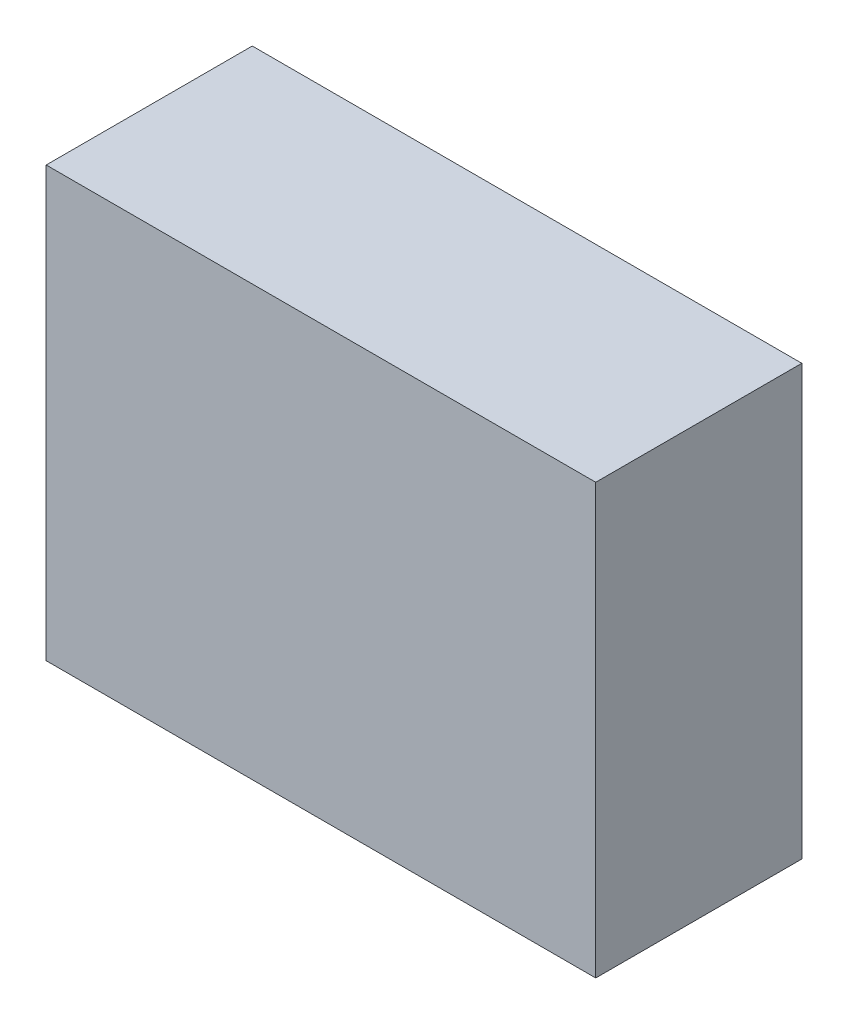
ISO-10303-21;
HEADER;
FILE_DESCRIPTION(('STEP AP214'),'2;1');
FILE_NAME('part.step','',(''),(''),'','','');
FILE_SCHEMA(('AUTOMOTIVE_DESIGN { 1 0 10303 214 1 1 1 1 }'));
ENDSEC;
DATA;
#1=APPLICATION_CONTEXT('core data for automotive mechanical design processes');
#2=APPLICATION_PROTOCOL_DEFINITION('international standard','automotive_design',2000,#1);
#3=PRODUCT_CONTEXT('',#1,'mechanical');
#4=PRODUCT('Part','Part','',(#3));
#5=PRODUCT_RELATED_PRODUCT_CATEGORY('part','',(#4));
#6=PRODUCT_DEFINITION_FORMATION('','',#4);
#7=PRODUCT_DEFINITION_CONTEXT('part definition',#1,'design');
#8=PRODUCT_DEFINITION('design','',#6,#7);
#9=PRODUCT_DEFINITION_SHAPE('','',#8);
#10=(LENGTH_UNIT() NAMED_UNIT(*) SI_UNIT(.MILLI.,.METRE.));
#11=(NAMED_UNIT(*) PLANE_ANGLE_UNIT() SI_UNIT($,.RADIAN.));
#12=(NAMED_UNIT(*) SI_UNIT($,.STERADIAN.) SOLID_ANGLE_UNIT());
#13=UNCERTAINTY_MEASURE_WITH_UNIT(LENGTH_MEASURE(1.E-05),#10,'distance_accuracy_value','');
#14=(GEOMETRIC_REPRESENTATION_CONTEXT(3) GLOBAL_UNCERTAINTY_ASSIGNED_CONTEXT((#13)) GLOBAL_UNIT_ASSIGNED_CONTEXT((#10,
#11,#12)) REPRESENTATION_CONTEXT('',''));
#15=CARTESIAN_POINT('',(0.,0.,0.));
#16=DIRECTION('',(0.,0.,1.));
#17=DIRECTION('',(1.,0.,0.));
#18=AXIS2_PLACEMENT_3D('',#15,#16,#17);
#19=CARTESIAN_POINT('',(24.,-18.75,18.));
#20=DIRECTION('',(-1.,0.,0.));
#21=DIRECTION('',(0.,0.,1.));
#22=AXIS2_PLACEMENT_3D('',#19,#20,#21);
#23=PLANE('',#22);
#24=DIRECTION('',(0.,1.,0.));
#25=VECTOR('',#24,1.);
#26=CARTESIAN_POINT('',(24.,-18.75,0.));
#27=LINE('',#26,#25);
#28=CARTESIAN_POINT('',(24.,-18.75,0.));
#29=VERTEX_POINT('',#28);
#30=CARTESIAN_POINT('',(24.,18.75,0.));
#31=VERTEX_POINT('',#30);
#32=EDGE_CURVE('E111',#29,#31,#27,.T.);
#33=ORIENTED_EDGE('',*,*,#32,.T.);
#34=DIRECTION('',(0.,0.,-1.));
#35=VECTOR('',#34,1.);
#36=CARTESIAN_POINT('',(24.,18.75,18.));
#37=LINE('',#36,#35);
#38=CARTESIAN_POINT('',(24.,18.75,18.));
#39=VERTEX_POINT('',#38);
#40=EDGE_CURVE('E11',#39,#31,#37,.T.);
#41=ORIENTED_EDGE('',*,*,#40,.F.);
#42=DIRECTION('',(0.,1.,0.));
#43=VECTOR('',#42,1.);
#44=CARTESIAN_POINT('',(24.,-18.75,18.));
#45=LINE('',#44,#43);
#46=CARTESIAN_POINT('',(24.,-18.75,18.));
#47=VERTEX_POINT('',#46);
#48=EDGE_CURVE('E95',#47,#39,#45,.T.);
#49=ORIENTED_EDGE('',*,*,#48,.F.);
#50=DIRECTION('',(0.,0.,-1.));
#51=VECTOR('',#50,1.);
#52=CARTESIAN_POINT('',(24.,-18.75,18.));
#53=LINE('',#52,#51);
#54=EDGE_CURVE('E107',#47,#29,#53,.T.);
#55=ORIENTED_EDGE('',*,*,#54,.T.);
#56=EDGE_LOOP('',(#33,#41,#49,#55));
#57=FACE_BOUND('',#56,.T.);
#58=ADVANCED_FACE('F43',(#57),#23,.F.);
#59=CARTESIAN_POINT('',(-24.,18.75,18.));
#60=DIRECTION('',(0.,-1.,0.));
#61=DIRECTION('',(0.,0.,-1.));
#62=AXIS2_PLACEMENT_3D('',#59,#60,#61);
#63=PLANE('',#62);
#64=DIRECTION('',(-1.,0.,0.));
#65=VECTOR('',#64,1.);
#66=CARTESIAN_POINT('',(-24.,18.75,0.));
#67=LINE('',#66,#65);
#68=CARTESIAN_POINT('',(-24.,18.75,0.));
#69=VERTEX_POINT('',#68);
#70=EDGE_CURVE('E100',#31,#69,#67,.T.);
#71=ORIENTED_EDGE('',*,*,#70,.T.);
#72=DIRECTION('',(0.,0.,-1.));
#73=VECTOR('',#72,1.);
#74=CARTESIAN_POINT('',(-24.,18.75,18.));
#75=LINE('',#74,#73);
#76=CARTESIAN_POINT('',(-24.,18.75,18.));
#77=VERTEX_POINT('',#76);
#78=EDGE_CURVE('E52',#77,#69,#75,.T.);
#79=ORIENTED_EDGE('',*,*,#78,.F.);
#80=DIRECTION('',(-1.,0.,0.));
#81=VECTOR('',#80,1.);
#82=CARTESIAN_POINT('',(-24.,18.75,18.));
#83=LINE('',#82,#81);
#84=EDGE_CURVE('E90',#39,#77,#83,.T.);
#85=ORIENTED_EDGE('',*,*,#84,.F.);
#86=ORIENTED_EDGE('',*,*,#40,.T.);
#87=EDGE_LOOP('',(#71,#79,#85,#86));
#88=FACE_BOUND('',#87,.T.);
#89=ADVANCED_FACE('F99',(#88),#63,.F.);
#90=CARTESIAN_POINT('',(-24.,-18.75,18.));
#91=DIRECTION('',(1.,0.,0.));
#92=DIRECTION('',(0.,0.,-1.));
#93=AXIS2_PLACEMENT_3D('',#90,#91,#92);
#94=PLANE('',#93);
#95=DIRECTION('',(0.,-1.,0.));
#96=VECTOR('',#95,1.);
#97=CARTESIAN_POINT('',(-24.,-18.75,0.));
#98=LINE('',#97,#96);
#99=CARTESIAN_POINT('',(-24.,-18.75,0.));
#100=VERTEX_POINT('',#99);
#101=EDGE_CURVE('E77',#69,#100,#98,.T.);
#102=ORIENTED_EDGE('',*,*,#101,.T.);
#103=DIRECTION('',(0.,0.,-1.));
#104=VECTOR('',#103,1.);
#105=CARTESIAN_POINT('',(-24.,-18.75,18.));
#106=LINE('',#105,#104);
#107=CARTESIAN_POINT('',(-24.,-18.75,18.));
#108=VERTEX_POINT('',#107);
#109=EDGE_CURVE('E102',#108,#100,#106,.T.);
#110=ORIENTED_EDGE('',*,*,#109,.F.);
#111=DIRECTION('',(0.,-1.,0.));
#112=VECTOR('',#111,1.);
#113=CARTESIAN_POINT('',(-24.,-18.75,18.));
#114=LINE('',#113,#112);
#115=EDGE_CURVE('E93',#77,#108,#114,.T.);
#116=ORIENTED_EDGE('',*,*,#115,.F.);
#117=ORIENTED_EDGE('',*,*,#78,.T.);
#118=EDGE_LOOP('',(#102,#110,#116,#117));
#119=FACE_BOUND('',#118,.T.);
#120=ADVANCED_FACE('F103',(#119),#94,.F.);
#121=CARTESIAN_POINT('',(-24.,-18.75,18.));
#122=DIRECTION('',(0.,1.,0.));
#123=DIRECTION('',(0.,0.,1.));
#124=AXIS2_PLACEMENT_3D('',#121,#122,#123);
#125=PLANE('',#124);
#126=DIRECTION('',(1.,0.,0.));
#127=VECTOR('',#126,1.);
#128=CARTESIAN_POINT('',(-24.,-18.75,0.));
#129=LINE('',#128,#127);
#130=EDGE_CURVE('E83',#100,#29,#129,.T.);
#131=ORIENTED_EDGE('',*,*,#130,.T.);
#132=ORIENTED_EDGE('',*,*,#54,.F.);
#133=DIRECTION('',(1.,0.,0.));
#134=VECTOR('',#133,1.);
#135=CARTESIAN_POINT('',(-24.,-18.75,18.));
#136=LINE('',#135,#134);
#137=EDGE_CURVE('E60',#108,#47,#136,.T.);
#138=ORIENTED_EDGE('',*,*,#137,.F.);
#139=ORIENTED_EDGE('',*,*,#109,.T.);
#140=EDGE_LOOP('',(#131,#132,#138,#139));
#141=FACE_BOUND('',#140,.T.);
#142=ADVANCED_FACE('F124',(#141),#125,.F.);
#143=CARTESIAN_POINT('',(0.,0.,18.));
#144=DIRECTION('',(0.,0.,-1.));
#145=DIRECTION('',(-1.,0.,0.));
#146=AXIS2_PLACEMENT_3D('',#143,#144,#145);
#147=PLANE('',#146);
#148=ORIENTED_EDGE('',*,*,#48,.T.);
#149=ORIENTED_EDGE('',*,*,#84,.T.);
#150=ORIENTED_EDGE('',*,*,#115,.T.);
#151=ORIENTED_EDGE('',*,*,#137,.T.);
#152=EDGE_LOOP('',(#148,#149,#150,#151));
#153=FACE_BOUND('',#152,.T.);
#154=ADVANCED_FACE('F91',(#153),#147,.F.);
#155=CARTESIAN_POINT('',(0.,0.,0.));
#156=DIRECTION('',(0.,0.,-1.));
#157=DIRECTION('',(-1.,0.,0.));
#158=AXIS2_PLACEMENT_3D('',#155,#156,#157);
#159=PLANE('',#158);
#160=ORIENTED_EDGE('',*,*,#32,.F.);
#161=ORIENTED_EDGE('',*,*,#130,.F.);
#162=ORIENTED_EDGE('',*,*,#101,.F.);
#163=ORIENTED_EDGE('',*,*,#70,.F.);
#164=EDGE_LOOP('',(#160,#161,#162,#163));
#165=FACE_BOUND('',#164,.T.);
#166=ADVANCED_FACE('F127',(#165),#159,.T.);
#167=CLOSED_SHELL('',(#58,#89,#120,#142,#154,#166));
#168=MANIFOLD_SOLID_BREP('B2',#167);
#169=ADVANCED_BREP_SHAPE_REPRESENTATION('',(#18,#168),#14);
#170=SHAPE_DEFINITION_REPRESENTATION(#9,#169);
ENDSEC;
END-ISO-10303-21;
